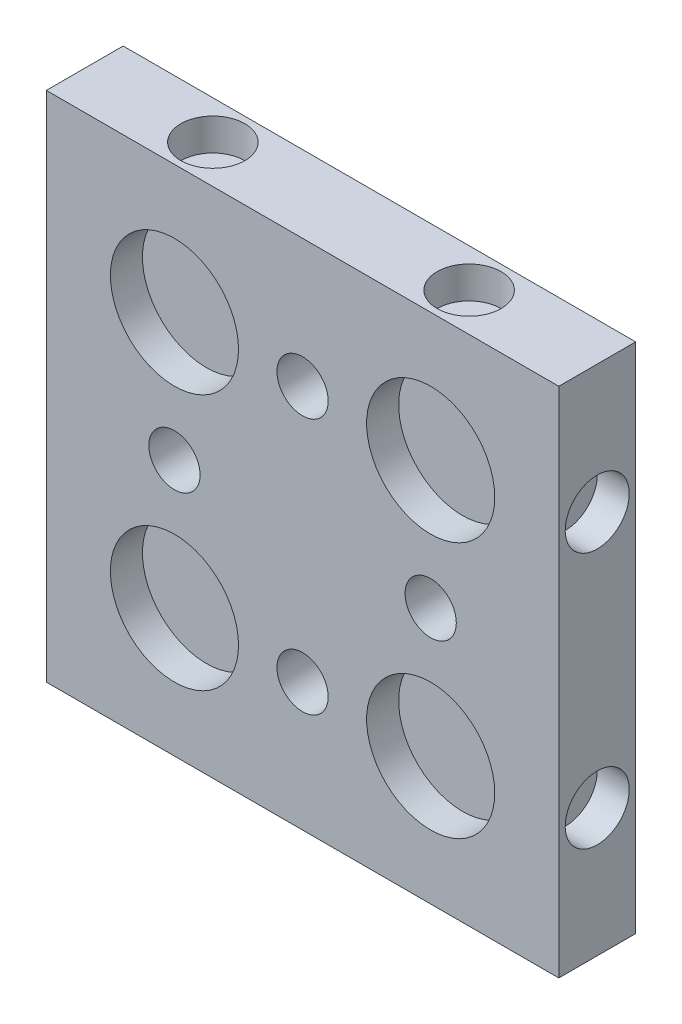
ISO-10303-21;
HEADER;
FILE_DESCRIPTION(('STEP AP214'),'2;1');
FILE_NAME('part.step','',(''),(''),'','','');
FILE_SCHEMA(('AUTOMOTIVE_DESIGN { 1 0 10303 214 1 1 1 1 }'));
ENDSEC;
DATA;
#1=APPLICATION_CONTEXT('core data for automotive mechanical design processes');
#2=APPLICATION_PROTOCOL_DEFINITION('international standard','automotive_design',2000,#1);
#3=PRODUCT_CONTEXT('',#1,'mechanical');
#4=PRODUCT('Part','Part','',(#3));
#5=PRODUCT_RELATED_PRODUCT_CATEGORY('part','',(#4));
#6=PRODUCT_DEFINITION_FORMATION('','',#4);
#7=PRODUCT_DEFINITION_CONTEXT('part definition',#1,'design');
#8=PRODUCT_DEFINITION('design','',#6,#7);
#9=PRODUCT_DEFINITION_SHAPE('','',#8);
#10=(LENGTH_UNIT() NAMED_UNIT(*) SI_UNIT(.MILLI.,.METRE.));
#11=(NAMED_UNIT(*) PLANE_ANGLE_UNIT() SI_UNIT($,.RADIAN.));
#12=(NAMED_UNIT(*) SI_UNIT($,.STERADIAN.) SOLID_ANGLE_UNIT());
#13=UNCERTAINTY_MEASURE_WITH_UNIT(LENGTH_MEASURE(1.E-05),#10,'distance_accuracy_value','');
#14=(GEOMETRIC_REPRESENTATION_CONTEXT(3) GLOBAL_UNCERTAINTY_ASSIGNED_CONTEXT((#13)) GLOBAL_UNIT_ASSIGNED_CONTEXT((#10,
#11,#12)) REPRESENTATION_CONTEXT('',''));
#15=CARTESIAN_POINT('',(0.,0.,0.));
#16=DIRECTION('',(0.,0.,1.));
#17=DIRECTION('',(1.,0.,0.));
#18=AXIS2_PLACEMENT_3D('',#15,#16,#17);
#19=CARTESIAN_POINT('',(-21.3507246376812,25.9521739130435,7.62));
#20=DIRECTION('',(1.,0.,0.));
#21=DIRECTION('',(0.,1.,0.));
#22=AXIS2_PLACEMENT_3D('',#19,#20,#21);
#23=PLANE('',#22);
#24=CARTESIAN_POINT('',(-21.3507246376812,13.2521739130435,3.81));
#25=DIRECTION('',(-1.,0.,0.));
#26=DIRECTION('',(0.,-1.,0.));
#27=AXIS2_PLACEMENT_3D('',#24,#25,#26);
#28=CIRCLE('',#27,3.175);
#29=CARTESIAN_POINT('',(-21.3507246376812,10.0771739130435,3.81));
#30=VERTEX_POINT('',#29);
#31=EDGE_CURVE('E239',#30,#30,#28,.T.);
#32=ORIENTED_EDGE('',*,*,#31,.F.);
#33=EDGE_LOOP('',(#32));
#34=FACE_BOUND('',#33,.T.);
#35=CARTESIAN_POINT('',(-21.3507246376812,-12.1478260869565,3.81));
#36=DIRECTION('',(-1.,0.,0.));
#37=DIRECTION('',(0.,-1.,0.));
#38=AXIS2_PLACEMENT_3D('',#35,#36,#37);
#39=CIRCLE('',#38,3.175);
#40=CARTESIAN_POINT('',(-21.3507246376812,-15.3228260869565,3.81));
#41=VERTEX_POINT('',#40);
#42=EDGE_CURVE('E234',#41,#41,#39,.T.);
#43=ORIENTED_EDGE('',*,*,#42,.F.);
#44=EDGE_LOOP('',(#43));
#45=FACE_BOUND('',#44,.T.);
#46=DIRECTION('',(0.,-1.,0.));
#47=VECTOR('',#46,1.);
#48=CARTESIAN_POINT('',(-21.3507246376812,25.9521739130435,0.));
#49=LINE('',#48,#47);
#50=CARTESIAN_POINT('',(-21.3507246376812,25.9521739130435,0.));
#51=VERTEX_POINT('',#50);
#52=CARTESIAN_POINT('',(-21.3507246376812,-24.8478260869565,0.));
#53=VERTEX_POINT('',#52);
#54=EDGE_CURVE('E113',#51,#53,#49,.T.);
#55=ORIENTED_EDGE('',*,*,#54,.T.);
#56=DIRECTION('',(0.,0.,-1.));
#57=VECTOR('',#56,1.);
#58=CARTESIAN_POINT('',(-21.3507246376812,-24.8478260869565,7.62));
#59=LINE('',#58,#57);
#60=CARTESIAN_POINT('',(-21.3507246376812,-24.8478260869565,7.62));
#61=VERTEX_POINT('',#60);
#62=EDGE_CURVE('E11',#61,#53,#59,.T.);
#63=ORIENTED_EDGE('',*,*,#62,.F.);
#64=DIRECTION('',(0.,-1.,0.));
#65=VECTOR('',#64,1.);
#66=CARTESIAN_POINT('',(-21.3507246376812,25.9521739130435,7.62));
#67=LINE('',#66,#65);
#68=CARTESIAN_POINT('',(-21.3507246376812,25.9521739130435,7.62));
#69=VERTEX_POINT('',#68);
#70=EDGE_CURVE('E97',#69,#61,#67,.T.);
#71=ORIENTED_EDGE('',*,*,#70,.F.);
#72=DIRECTION('',(0.,0.,-1.));
#73=VECTOR('',#72,1.);
#74=CARTESIAN_POINT('',(-21.3507246376812,25.9521739130435,7.62));
#75=LINE('',#74,#73);
#76=EDGE_CURVE('E109',#69,#51,#75,.T.);
#77=ORIENTED_EDGE('',*,*,#76,.T.);
#78=EDGE_LOOP('',(#55,#63,#71,#77));
#79=FACE_BOUND('',#78,.T.);
#80=ADVANCED_FACE('F45',(#34,#45,#79),#23,.F.);
#81=CARTESIAN_POINT('',(-21.3507246376812,-24.8478260869565,7.62));
#82=DIRECTION('',(0.,1.,0.));
#83=DIRECTION('',(0.,0.,1.));
#84=AXIS2_PLACEMENT_3D('',#81,#82,#83);
#85=PLANE('',#84);
#86=CARTESIAN_POINT('',(-8.65072463768117,-24.8478260869565,3.81));
#87=DIRECTION('',(0.,-1.,0.));
#88=DIRECTION('',(0.,0.,-1.));
#89=AXIS2_PLACEMENT_3D('',#86,#87,#88);
#90=CIRCLE('',#89,3.175);
#91=CARTESIAN_POINT('',(-8.65072463768117,-24.8478260869565,0.634999999999998));
#92=VERTEX_POINT('',#91);
#93=EDGE_CURVE('E223',#92,#92,#90,.T.);
#94=ORIENTED_EDGE('',*,*,#93,.F.);
#95=EDGE_LOOP('',(#94));
#96=FACE_BOUND('',#95,.T.);
#97=CARTESIAN_POINT('',(16.7492753623188,-24.8478260869565,3.81));
#98=DIRECTION('',(0.,-1.,0.));
#99=DIRECTION('',(0.,0.,-1.));
#100=AXIS2_PLACEMENT_3D('',#97,#98,#99);
#101=CIRCLE('',#100,3.175);
#102=CARTESIAN_POINT('',(16.7492753623188,-24.8478260869565,0.634999999999998));
#103=VERTEX_POINT('',#102);
#104=EDGE_CURVE('E218',#103,#103,#101,.T.);
#105=ORIENTED_EDGE('',*,*,#104,.F.);
#106=EDGE_LOOP('',(#105));
#107=FACE_BOUND('',#106,.T.);
#108=DIRECTION('',(1.,0.,0.));
#109=VECTOR('',#108,1.);
#110=CARTESIAN_POINT('',(-21.3507246376812,-24.8478260869565,0.));
#111=LINE('',#110,#109);
#112=CARTESIAN_POINT('',(29.4492753623188,-24.8478260869565,0.));
#113=VERTEX_POINT('',#112);
#114=EDGE_CURVE('E102',#53,#113,#111,.T.);
#115=ORIENTED_EDGE('',*,*,#114,.T.);
#116=DIRECTION('',(0.,0.,-1.));
#117=VECTOR('',#116,1.);
#118=CARTESIAN_POINT('',(29.4492753623188,-24.8478260869565,7.62));
#119=LINE('',#118,#117);
#120=CARTESIAN_POINT('',(29.4492753623188,-24.8478260869565,7.62));
#121=VERTEX_POINT('',#120);
#122=EDGE_CURVE('E54',#121,#113,#119,.T.);
#123=ORIENTED_EDGE('',*,*,#122,.F.);
#124=DIRECTION('',(1.,0.,0.));
#125=VECTOR('',#124,1.);
#126=CARTESIAN_POINT('',(-21.3507246376812,-24.8478260869565,7.62));
#127=LINE('',#126,#125);
#128=EDGE_CURVE('E92',#61,#121,#127,.T.);
#129=ORIENTED_EDGE('',*,*,#128,.F.);
#130=ORIENTED_EDGE('',*,*,#62,.T.);
#131=EDGE_LOOP('',(#115,#123,#129,#130));
#132=FACE_BOUND('',#131,.T.);
#133=ADVANCED_FACE('F101',(#96,#107,#132),#85,.F.);
#134=CARTESIAN_POINT('',(29.4492753623188,25.9521739130435,7.62));
#135=DIRECTION('',(-1.,0.,0.));
#136=DIRECTION('',(0.,-1.,0.));
#137=AXIS2_PLACEMENT_3D('',#134,#135,#136);
#138=PLANE('',#137);
#139=CARTESIAN_POINT('',(29.4492753623188,13.2521739130435,3.81));
#140=DIRECTION('',(1.,0.,0.));
#141=DIRECTION('',(0.,1.,0.));
#142=AXIS2_PLACEMENT_3D('',#139,#140,#141);
#143=CIRCLE('',#142,3.175);
#144=CARTESIAN_POINT('',(29.4492753623188,16.4271739130435,3.81));
#145=VERTEX_POINT('',#144);
#146=EDGE_CURVE('E207',#145,#145,#143,.T.);
#147=ORIENTED_EDGE('',*,*,#146,.F.);
#148=EDGE_LOOP('',(#147));
#149=FACE_BOUND('',#148,.T.);
#150=CARTESIAN_POINT('',(29.4492753623188,-12.1478260869565,3.81));
#151=DIRECTION('',(1.,0.,0.));
#152=DIRECTION('',(0.,1.,0.));
#153=AXIS2_PLACEMENT_3D('',#150,#151,#152);
#154=CIRCLE('',#153,3.175);
#155=CARTESIAN_POINT('',(29.4492753623188,-8.97282608695651,3.81));
#156=VERTEX_POINT('',#155);
#157=EDGE_CURVE('E202',#156,#156,#154,.T.);
#158=ORIENTED_EDGE('',*,*,#157,.F.);
#159=EDGE_LOOP('',(#158));
#160=FACE_BOUND('',#159,.T.);
#161=DIRECTION('',(0.,1.,0.));
#162=VECTOR('',#161,1.);
#163=CARTESIAN_POINT('',(29.4492753623188,25.9521739130435,0.));
#164=LINE('',#163,#162);
#165=CARTESIAN_POINT('',(29.4492753623188,25.9521739130435,0.));
#166=VERTEX_POINT('',#165);
#167=EDGE_CURVE('E79',#113,#166,#164,.T.);
#168=ORIENTED_EDGE('',*,*,#167,.T.);
#169=DIRECTION('',(0.,0.,-1.));
#170=VECTOR('',#169,1.);
#171=CARTESIAN_POINT('',(29.4492753623188,25.9521739130435,7.62));
#172=LINE('',#171,#170);
#173=CARTESIAN_POINT('',(29.4492753623188,25.9521739130435,7.62));
#174=VERTEX_POINT('',#173);
#175=EDGE_CURVE('E104',#174,#166,#172,.T.);
#176=ORIENTED_EDGE('',*,*,#175,.F.);
#177=DIRECTION('',(0.,1.,0.));
#178=VECTOR('',#177,1.);
#179=CARTESIAN_POINT('',(29.4492753623188,25.9521739130435,7.62));
#180=LINE('',#179,#178);
#181=EDGE_CURVE('E95',#121,#174,#180,.T.);
#182=ORIENTED_EDGE('',*,*,#181,.F.);
#183=ORIENTED_EDGE('',*,*,#122,.T.);
#184=EDGE_LOOP('',(#168,#176,#182,#183));
#185=FACE_BOUND('',#184,.T.);
#186=ADVANCED_FACE('F105',(#149,#160,#185),#138,.F.);
#187=CARTESIAN_POINT('',(-21.3507246376812,25.9521739130435,7.62));
#188=DIRECTION('',(0.,-1.,0.));
#189=DIRECTION('',(0.,0.,-1.));
#190=AXIS2_PLACEMENT_3D('',#187,#188,#189);
#191=PLANE('',#190);
#192=CARTESIAN_POINT('',(-8.65072463768118,25.9521739130435,3.81));
#193=DIRECTION('',(0.,1.,0.));
#194=DIRECTION('',(0.,0.,1.));
#195=AXIS2_PLACEMENT_3D('',#192,#193,#194);
#196=CIRCLE('',#195,3.175);
#197=CARTESIAN_POINT('',(-8.65072463768118,25.9521739130435,6.985));
#198=VERTEX_POINT('',#197);
#199=EDGE_CURVE('E254',#198,#198,#196,.T.);
#200=ORIENTED_EDGE('',*,*,#199,.F.);
#201=EDGE_LOOP('',(#200));
#202=FACE_BOUND('',#201,.T.);
#203=CARTESIAN_POINT('',(16.7492753623188,25.9521739130435,3.81));
#204=DIRECTION('',(0.,1.,0.));
#205=DIRECTION('',(0.,0.,1.));
#206=AXIS2_PLACEMENT_3D('',#203,#204,#205);
#207=CIRCLE('',#206,3.175);
#208=CARTESIAN_POINT('',(16.7492753623188,25.9521739130435,6.985));
#209=VERTEX_POINT('',#208);
#210=EDGE_CURVE('E250',#209,#209,#207,.T.);
#211=ORIENTED_EDGE('',*,*,#210,.F.);
#212=EDGE_LOOP('',(#211));
#213=FACE_BOUND('',#212,.T.);
#214=DIRECTION('',(-1.,0.,0.));
#215=VECTOR('',#214,1.);
#216=CARTESIAN_POINT('',(-21.3507246376812,25.9521739130435,0.));
#217=LINE('',#216,#215);
#218=EDGE_CURVE('E85',#166,#51,#217,.T.);
#219=ORIENTED_EDGE('',*,*,#218,.T.);
#220=ORIENTED_EDGE('',*,*,#76,.F.);
#221=DIRECTION('',(-1.,0.,0.));
#222=VECTOR('',#221,1.);
#223=CARTESIAN_POINT('',(-21.3507246376812,25.9521739130435,7.62));
#224=LINE('',#223,#222);
#225=EDGE_CURVE('E62',#174,#69,#224,.T.);
#226=ORIENTED_EDGE('',*,*,#225,.F.);
#227=ORIENTED_EDGE('',*,*,#175,.T.);
#228=EDGE_LOOP('',(#219,#220,#226,#227));
#229=FACE_BOUND('',#228,.T.);
#230=ADVANCED_FACE('F127',(#202,#213,#229),#191,.F.);
#231=CARTESIAN_POINT('',(0.,0.,7.62));
#232=DIRECTION('',(0.,0.,1.));
#233=DIRECTION('',(1.,0.,0.));
#234=AXIS2_PLACEMENT_3D('',#231,#232,#233);
#235=PLANE('',#234);
#236=CARTESIAN_POINT('',(-8.65072463768118,-12.1478260869565,7.62));
#237=DIRECTION('',(0.,0.,1.));
#238=DIRECTION('',(1.,0.,0.));
#239=AXIS2_PLACEMENT_3D('',#236,#237,#238);
#240=CIRCLE('',#239,6.35);
#241=CARTESIAN_POINT('',(-2.30072463768118,-12.1478260869565,7.62));
#242=VERTEX_POINT('',#241);
#243=EDGE_CURVE('E178',#242,#242,#240,.T.);
#244=ORIENTED_EDGE('',*,*,#243,.F.);
#245=EDGE_LOOP('',(#244));
#246=FACE_BOUND('',#245,.T.);
#247=CARTESIAN_POINT('',(16.7492753623188,-12.1478260869565,7.62));
#248=DIRECTION('',(0.,0.,1.));
#249=DIRECTION('',(1.,0.,0.));
#250=AXIS2_PLACEMENT_3D('',#247,#248,#249);
#251=CIRCLE('',#250,6.35);
#252=CARTESIAN_POINT('',(23.0992753623188,-12.1478260869565,7.62));
#253=VERTEX_POINT('',#252);
#254=EDGE_CURVE('E187',#253,#253,#251,.T.);
#255=ORIENTED_EDGE('',*,*,#254,.F.);
#256=EDGE_LOOP('',(#255));
#257=FACE_BOUND('',#256,.T.);
#258=CARTESIAN_POINT('',(16.7492753623188,13.2521739130435,7.62));
#259=DIRECTION('',(0.,0.,1.));
#260=DIRECTION('',(1.,0.,0.));
#261=AXIS2_PLACEMENT_3D('',#258,#259,#260);
#262=CIRCLE('',#261,6.35);
#263=CARTESIAN_POINT('',(23.0992753623188,13.2521739130435,7.62));
#264=VERTEX_POINT('',#263);
#265=EDGE_CURVE('E170',#264,#264,#262,.T.);
#266=ORIENTED_EDGE('',*,*,#265,.F.);
#267=EDGE_LOOP('',(#266));
#268=FACE_BOUND('',#267,.T.);
#269=CARTESIAN_POINT('',(-8.65072463768118,13.2521739130435,7.62));
#270=DIRECTION('',(0.,0.,1.));
#271=DIRECTION('',(1.,0.,0.));
#272=AXIS2_PLACEMENT_3D('',#269,#270,#271);
#273=CIRCLE('',#272,6.35);
#274=CARTESIAN_POINT('',(-2.30072463768118,13.2521739130435,7.62));
#275=VERTEX_POINT('',#274);
#276=EDGE_CURVE('E166',#275,#275,#273,.T.);
#277=ORIENTED_EDGE('',*,*,#276,.F.);
#278=EDGE_LOOP('',(#277));
#279=FACE_BOUND('',#278,.T.);
#280=CARTESIAN_POINT('',(-8.65072463768117,0.552173913043488,7.62));
#281=DIRECTION('',(0.,0.,1.));
#282=DIRECTION('',(1.,0.,0.));
#283=AXIS2_PLACEMENT_3D('',#280,#281,#282);
#284=CIRCLE('',#283,2.54);
#285=CARTESIAN_POINT('',(-6.11072463768117,0.552173913043488,7.62));
#286=VERTEX_POINT('',#285);
#287=EDGE_CURVE('E159',#286,#286,#284,.T.);
#288=ORIENTED_EDGE('',*,*,#287,.F.);
#289=EDGE_LOOP('',(#288));
#290=FACE_BOUND('',#289,.T.);
#291=CARTESIAN_POINT('',(4.04927536231882,13.2521739130435,7.62));
#292=DIRECTION('',(0.,0.,1.));
#293=DIRECTION('',(1.,0.,0.));
#294=AXIS2_PLACEMENT_3D('',#291,#292,#293);
#295=CIRCLE('',#294,2.54);
#296=CARTESIAN_POINT('',(6.58927536231882,13.2521739130435,7.62));
#297=VERTEX_POINT('',#296);
#298=EDGE_CURVE('E155',#297,#297,#295,.T.);
#299=ORIENTED_EDGE('',*,*,#298,.F.);
#300=EDGE_LOOP('',(#299));
#301=FACE_BOUND('',#300,.T.);
#302=CARTESIAN_POINT('',(4.04927536231883,-12.1478260869565,7.62));
#303=DIRECTION('',(0.,0.,1.));
#304=DIRECTION('',(1.,0.,0.));
#305=AXIS2_PLACEMENT_3D('',#302,#303,#304);
#306=CIRCLE('',#305,2.54);
#307=CARTESIAN_POINT('',(6.58927536231883,-12.1478260869565,7.62));
#308=VERTEX_POINT('',#307);
#309=EDGE_CURVE('E147',#308,#308,#306,.T.);
#310=ORIENTED_EDGE('',*,*,#309,.F.);
#311=EDGE_LOOP('',(#310));
#312=FACE_BOUND('',#311,.T.);
#313=CARTESIAN_POINT('',(16.7492753623188,0.552173913043491,7.62));
#314=DIRECTION('',(0.,0.,1.));
#315=DIRECTION('',(1.,0.,0.));
#316=AXIS2_PLACEMENT_3D('',#313,#314,#315);
#317=CIRCLE('',#316,2.54);
#318=CARTESIAN_POINT('',(19.2892753623188,0.552173913043491,7.62));
#319=VERTEX_POINT('',#318);
#320=EDGE_CURVE('E138',#319,#319,#317,.T.);
#321=ORIENTED_EDGE('',*,*,#320,.F.);
#322=EDGE_LOOP('',(#321));
#323=FACE_BOUND('',#322,.T.);
#324=ORIENTED_EDGE('',*,*,#70,.T.);
#325=ORIENTED_EDGE('',*,*,#128,.T.);
#326=ORIENTED_EDGE('',*,*,#181,.T.);
#327=ORIENTED_EDGE('',*,*,#225,.T.);
#328=EDGE_LOOP('',(#324,#325,#326,#327));
#329=FACE_BOUND('',#328,.T.);
#330=ADVANCED_FACE('F93',(#246,#257,#268,#279,#290,#301,#312,#323,#329),#235,.T.);
#331=CARTESIAN_POINT('',(0.,0.,0.));
#332=DIRECTION('',(0.,0.,1.));
#333=DIRECTION('',(1.,0.,0.));
#334=AXIS2_PLACEMENT_3D('',#331,#332,#333);
#335=PLANE('',#334);
#336=ORIENTED_EDGE('',*,*,#54,.F.);
#337=ORIENTED_EDGE('',*,*,#218,.F.);
#338=ORIENTED_EDGE('',*,*,#167,.F.);
#339=ORIENTED_EDGE('',*,*,#114,.F.);
#340=EDGE_LOOP('',(#336,#337,#338,#339));
#341=FACE_BOUND('',#340,.T.);
#342=ADVANCED_FACE('F130',(#341),#335,.F.);
#343=CARTESIAN_POINT('',(16.7492753623188,0.552173913043491,1.27));
#344=DIRECTION('',(0.,0.,1.));
#345=DIRECTION('',(1.,0.,0.));
#346=AXIS2_PLACEMENT_3D('',#343,#344,#345);
#347=CYLINDRICAL_SURFACE('',#346,2.54);
#348=CARTESIAN_POINT('',(16.7492753623188,0.552173913043491,1.27));
#349=DIRECTION('',(0.,0.,1.));
#350=DIRECTION('',(1.,0.,0.));
#351=AXIS2_PLACEMENT_3D('',#348,#349,#350);
#352=CIRCLE('',#351,2.54);
#353=CARTESIAN_POINT('',(19.2892753623188,0.552173913043491,1.27));
#354=VERTEX_POINT('',#353);
#355=EDGE_CURVE('E134',#354,#354,#352,.T.);
#356=ORIENTED_EDGE('',*,*,#355,.F.);
#357=EDGE_LOOP('',(#356));
#358=FACE_BOUND('',#357,.T.);
#359=ORIENTED_EDGE('',*,*,#320,.T.);
#360=EDGE_LOOP('',(#359));
#361=FACE_BOUND('',#360,.T.);
#362=ADVANCED_FACE('F403',(#358,#361),#347,.F.);
#363=CARTESIAN_POINT('',(16.7492753623188,0.552173913043491,1.27));
#364=DIRECTION('',(0.,0.,1.));
#365=DIRECTION('',(1.,0.,0.));
#366=AXIS2_PLACEMENT_3D('',#363,#364,#365);
#367=PLANE('',#366);
#368=ORIENTED_EDGE('',*,*,#355,.T.);
#369=EDGE_LOOP('',(#368));
#370=FACE_BOUND('',#369,.T.);
#371=ADVANCED_FACE('F398',(#370),#367,.T.);
#372=CARTESIAN_POINT('',(4.04927536231883,-12.1478260869565,1.27));
#373=DIRECTION('',(0.,0.,1.));
#374=DIRECTION('',(1.,0.,0.));
#375=AXIS2_PLACEMENT_3D('',#372,#373,#374);
#376=CYLINDRICAL_SURFACE('',#375,2.54);
#377=CARTESIAN_POINT('',(4.04927536231883,-12.1478260869565,1.27));
#378=DIRECTION('',(0.,0.,1.));
#379=DIRECTION('',(1.,0.,0.));
#380=AXIS2_PLACEMENT_3D('',#377,#378,#379);
#381=CIRCLE('',#380,2.54);
#382=CARTESIAN_POINT('',(6.58927536231883,-12.1478260869565,1.27));
#383=VERTEX_POINT('',#382);
#384=EDGE_CURVE('E143',#383,#383,#381,.T.);
#385=ORIENTED_EDGE('',*,*,#384,.F.);
#386=EDGE_LOOP('',(#385));
#387=FACE_BOUND('',#386,.T.);
#388=ORIENTED_EDGE('',*,*,#309,.T.);
#389=EDGE_LOOP('',(#388));
#390=FACE_BOUND('',#389,.T.);
#391=ADVANCED_FACE('F395',(#387,#390),#376,.F.);
#392=CARTESIAN_POINT('',(4.04927536231883,-12.1478260869565,1.27));
#393=DIRECTION('',(0.,0.,1.));
#394=DIRECTION('',(1.,0.,0.));
#395=AXIS2_PLACEMENT_3D('',#392,#393,#394);
#396=PLANE('',#395);
#397=ORIENTED_EDGE('',*,*,#384,.T.);
#398=EDGE_LOOP('',(#397));
#399=FACE_BOUND('',#398,.T.);
#400=ADVANCED_FACE('F390',(#399),#396,.T.);
#401=CARTESIAN_POINT('',(4.04927536231882,13.2521739130435,1.27));
#402=DIRECTION('',(0.,0.,1.));
#403=DIRECTION('',(1.,0.,0.));
#404=AXIS2_PLACEMENT_3D('',#401,#402,#403);
#405=CYLINDRICAL_SURFACE('',#404,2.54);
#406=CARTESIAN_POINT('',(4.04927536231882,13.2521739130435,1.27));
#407=DIRECTION('',(0.,0.,1.));
#408=DIRECTION('',(1.,0.,0.));
#409=AXIS2_PLACEMENT_3D('',#406,#407,#408);
#410=CIRCLE('',#409,2.54);
#411=CARTESIAN_POINT('',(6.58927536231882,13.2521739130435,1.27));
#412=VERTEX_POINT('',#411);
#413=EDGE_CURVE('E151',#412,#412,#410,.T.);
#414=ORIENTED_EDGE('',*,*,#413,.F.);
#415=EDGE_LOOP('',(#414));
#416=FACE_BOUND('',#415,.T.);
#417=ORIENTED_EDGE('',*,*,#298,.T.);
#418=EDGE_LOOP('',(#417));
#419=FACE_BOUND('',#418,.T.);
#420=ADVANCED_FACE('F387',(#416,#419),#405,.F.);
#421=CARTESIAN_POINT('',(4.04927536231882,13.2521739130435,1.27));
#422=DIRECTION('',(0.,0.,1.));
#423=DIRECTION('',(1.,0.,0.));
#424=AXIS2_PLACEMENT_3D('',#421,#422,#423);
#425=PLANE('',#424);
#426=ORIENTED_EDGE('',*,*,#413,.T.);
#427=EDGE_LOOP('',(#426));
#428=FACE_BOUND('',#427,.T.);
#429=ADVANCED_FACE('F385',(#428),#425,.T.);
#430=CARTESIAN_POINT('',(-8.65072463768117,0.552173913043488,1.27));
#431=DIRECTION('',(0.,0.,1.));
#432=DIRECTION('',(1.,0.,0.));
#433=AXIS2_PLACEMENT_3D('',#430,#431,#432);
#434=CYLINDRICAL_SURFACE('',#433,2.54);
#435=CARTESIAN_POINT('',(-8.65072463768117,0.552173913043488,1.27));
#436=DIRECTION('',(0.,0.,1.));
#437=DIRECTION('',(1.,0.,0.));
#438=AXIS2_PLACEMENT_3D('',#435,#436,#437);
#439=CIRCLE('',#438,2.54);
#440=CARTESIAN_POINT('',(-6.11072463768117,0.552173913043488,1.27));
#441=VERTEX_POINT('',#440);
#442=EDGE_CURVE('E117',#441,#441,#439,.T.);
#443=ORIENTED_EDGE('',*,*,#442,.F.);
#444=EDGE_LOOP('',(#443));
#445=FACE_BOUND('',#444,.T.);
#446=ORIENTED_EDGE('',*,*,#287,.T.);
#447=EDGE_LOOP('',(#446));
#448=FACE_BOUND('',#447,.T.);
#449=ADVANCED_FACE('F381',(#445,#448),#434,.F.);
#450=CARTESIAN_POINT('',(-8.65072463768117,0.552173913043488,1.27));
#451=DIRECTION('',(0.,0.,1.));
#452=DIRECTION('',(1.,0.,0.));
#453=AXIS2_PLACEMENT_3D('',#450,#451,#452);
#454=PLANE('',#453);
#455=ORIENTED_EDGE('',*,*,#442,.T.);
#456=EDGE_LOOP('',(#455));
#457=FACE_BOUND('',#456,.T.);
#458=ADVANCED_FACE('F377',(#457),#454,.T.);
#459=CARTESIAN_POINT('',(-8.65072463768118,13.2521739130435,4.445));
#460=DIRECTION('',(0.,0.,1.));
#461=DIRECTION('',(1.,0.,0.));
#462=AXIS2_PLACEMENT_3D('',#459,#460,#461);
#463=CYLINDRICAL_SURFACE('',#462,6.35);
#464=CARTESIAN_POINT('',(-8.65072463768118,13.2521739130435,4.445));
#465=DIRECTION('',(0.,0.,1.));
#466=DIRECTION('',(1.,0.,0.));
#467=AXIS2_PLACEMENT_3D('',#464,#465,#466);
#468=CIRCLE('',#467,6.35);
#469=CARTESIAN_POINT('',(-2.30072463768118,13.2521739130435,4.445));
#470=VERTEX_POINT('',#469);
#471=EDGE_CURVE('E139',#470,#470,#468,.T.);
#472=ORIENTED_EDGE('',*,*,#471,.F.);
#473=EDGE_LOOP('',(#472));
#474=FACE_BOUND('',#473,.T.);
#475=ORIENTED_EDGE('',*,*,#276,.T.);
#476=EDGE_LOOP('',(#475));
#477=FACE_BOUND('',#476,.T.);
#478=ADVANCED_FACE('F373',(#474,#477),#463,.F.);
#479=CARTESIAN_POINT('',(-8.65072463768118,13.2521739130435,4.445));
#480=DIRECTION('',(0.,0.,1.));
#481=DIRECTION('',(1.,0.,0.));
#482=AXIS2_PLACEMENT_3D('',#479,#480,#481);
#483=PLANE('',#482);
#484=ORIENTED_EDGE('',*,*,#471,.T.);
#485=EDGE_LOOP('',(#484));
#486=FACE_BOUND('',#485,.T.);
#487=ADVANCED_FACE('F351',(#486),#483,.T.);
#488=CARTESIAN_POINT('',(16.7492753623188,13.2521739130435,4.445));
#489=DIRECTION('',(0.,0.,1.));
#490=DIRECTION('',(1.,0.,0.));
#491=AXIS2_PLACEMENT_3D('',#488,#489,#490);
#492=CYLINDRICAL_SURFACE('',#491,6.35);
#493=CARTESIAN_POINT('',(16.7492753623188,13.2521739130435,4.445));
#494=DIRECTION('',(0.,0.,1.));
#495=DIRECTION('',(1.,0.,0.));
#496=AXIS2_PLACEMENT_3D('',#493,#494,#495);
#497=CIRCLE('',#496,6.35);
#498=CARTESIAN_POINT('',(23.0992753623188,13.2521739130435,4.445));
#499=VERTEX_POINT('',#498);
#500=EDGE_CURVE('E191',#499,#499,#497,.T.);
#501=ORIENTED_EDGE('',*,*,#500,.F.);
#502=EDGE_LOOP('',(#501));
#503=FACE_BOUND('',#502,.T.);
#504=ORIENTED_EDGE('',*,*,#265,.T.);
#505=EDGE_LOOP('',(#504));
#506=FACE_BOUND('',#505,.T.);
#507=ADVANCED_FACE('F347',(#503,#506),#492,.F.);
#508=CARTESIAN_POINT('',(16.7492753623188,13.2521739130435,4.445));
#509=DIRECTION('',(0.,0.,1.));
#510=DIRECTION('',(1.,0.,0.));
#511=AXIS2_PLACEMENT_3D('',#508,#509,#510);
#512=PLANE('',#511);
#513=ORIENTED_EDGE('',*,*,#500,.T.);
#514=EDGE_LOOP('',(#513));
#515=FACE_BOUND('',#514,.T.);
#516=ADVANCED_FACE('F350',(#515),#512,.T.);
#517=CARTESIAN_POINT('',(16.7492753623188,-12.1478260869565,4.445));
#518=DIRECTION('',(0.,0.,1.));
#519=DIRECTION('',(1.,0.,0.));
#520=AXIS2_PLACEMENT_3D('',#517,#518,#519);
#521=CYLINDRICAL_SURFACE('',#520,6.35);
#522=CARTESIAN_POINT('',(16.7492753623188,-12.1478260869565,4.445));
#523=DIRECTION('',(0.,0.,1.));
#524=DIRECTION('',(1.,0.,0.));
#525=AXIS2_PLACEMENT_3D('',#522,#523,#524);
#526=CIRCLE('',#525,6.35);
#527=CARTESIAN_POINT('',(23.0992753623188,-12.1478260869565,4.445));
#528=VERTEX_POINT('',#527);
#529=EDGE_CURVE('E183',#528,#528,#526,.T.);
#530=ORIENTED_EDGE('',*,*,#529,.F.);
#531=EDGE_LOOP('',(#530));
#532=FACE_BOUND('',#531,.T.);
#533=ORIENTED_EDGE('',*,*,#254,.T.);
#534=EDGE_LOOP('',(#533));
#535=FACE_BOUND('',#534,.T.);
#536=ADVANCED_FACE('F355',(#532,#535),#521,.F.);
#537=CARTESIAN_POINT('',(16.7492753623188,-12.1478260869565,4.445));
#538=DIRECTION('',(0.,0.,1.));
#539=DIRECTION('',(1.,0.,0.));
#540=AXIS2_PLACEMENT_3D('',#537,#538,#539);
#541=PLANE('',#540);
#542=ORIENTED_EDGE('',*,*,#529,.T.);
#543=EDGE_LOOP('',(#542));
#544=FACE_BOUND('',#543,.T.);
#545=ADVANCED_FACE('F359',(#544),#541,.T.);
#546=CARTESIAN_POINT('',(-8.65072463768118,-12.1478260869565,4.445));
#547=DIRECTION('',(0.,0.,1.));
#548=DIRECTION('',(1.,0.,0.));
#549=AXIS2_PLACEMENT_3D('',#546,#547,#548);
#550=CYLINDRICAL_SURFACE('',#549,6.35);
#551=CARTESIAN_POINT('',(-8.65072463768118,-12.1478260869565,4.445));
#552=DIRECTION('',(0.,0.,1.));
#553=DIRECTION('',(1.,0.,0.));
#554=AXIS2_PLACEMENT_3D('',#551,#552,#553);
#555=CIRCLE('',#554,6.35);
#556=CARTESIAN_POINT('',(-2.30072463768118,-12.1478260869565,4.445));
#557=VERTEX_POINT('',#556);
#558=EDGE_CURVE('E174',#557,#557,#555,.T.);
#559=ORIENTED_EDGE('',*,*,#558,.F.);
#560=EDGE_LOOP('',(#559));
#561=FACE_BOUND('',#560,.T.);
#562=ORIENTED_EDGE('',*,*,#243,.T.);
#563=EDGE_LOOP('',(#562));
#564=FACE_BOUND('',#563,.T.);
#565=ADVANCED_FACE('F363',(#561,#564),#550,.F.);
#566=CARTESIAN_POINT('',(-8.65072463768118,-12.1478260869565,4.445));
#567=DIRECTION('',(0.,0.,1.));
#568=DIRECTION('',(1.,0.,0.));
#569=AXIS2_PLACEMENT_3D('',#566,#567,#568);
#570=PLANE('',#569);
#571=ORIENTED_EDGE('',*,*,#558,.T.);
#572=EDGE_LOOP('',(#571));
#573=FACE_BOUND('',#572,.T.);
#574=ADVANCED_FACE('F342',(#573),#570,.T.);
#575=CARTESIAN_POINT('',(26.2742753623188,-12.1478260869565,3.81));
#576=DIRECTION('',(1.,0.,0.));
#577=DIRECTION('',(0.,1.,0.));
#578=AXIS2_PLACEMENT_3D('',#575,#576,#577);
#579=CYLINDRICAL_SURFACE('',#578,3.175);
#580=CARTESIAN_POINT('',(26.2742753623188,-12.1478260869565,3.81));
#581=DIRECTION('',(1.,0.,0.));
#582=DIRECTION('',(0.,1.,0.));
#583=AXIS2_PLACEMENT_3D('',#580,#581,#582);
#584=CIRCLE('',#583,3.175);
#585=CARTESIAN_POINT('',(26.2742753623188,-8.97282608695651,3.81));
#586=VERTEX_POINT('',#585);
#587=EDGE_CURVE('E198',#586,#586,#584,.T.);
#588=ORIENTED_EDGE('',*,*,#587,.F.);
#589=EDGE_LOOP('',(#588));
#590=FACE_BOUND('',#589,.T.);
#591=ORIENTED_EDGE('',*,*,#157,.T.);
#592=EDGE_LOOP('',(#591));
#593=FACE_BOUND('',#592,.T.);
#594=ADVANCED_FACE('F339',(#590,#593),#579,.F.);
#595=CARTESIAN_POINT('',(26.2742753623188,-12.1478260869565,3.81));
#596=DIRECTION('',(1.,0.,0.));
#597=DIRECTION('',(0.,1.,0.));
#598=AXIS2_PLACEMENT_3D('',#595,#596,#597);
#599=PLANE('',#598);
#600=ORIENTED_EDGE('',*,*,#587,.T.);
#601=EDGE_LOOP('',(#600));
#602=FACE_BOUND('',#601,.T.);
#603=ADVANCED_FACE('F337',(#602),#599,.T.);
#604=CARTESIAN_POINT('',(26.2742753623188,13.2521739130435,3.81));
#605=DIRECTION('',(1.,0.,0.));
#606=DIRECTION('',(0.,1.,0.));
#607=AXIS2_PLACEMENT_3D('',#604,#605,#606);
#608=CYLINDRICAL_SURFACE('',#607,3.175);
#609=CARTESIAN_POINT('',(26.2742753623188,13.2521739130435,3.81));
#610=DIRECTION('',(1.,0.,0.));
#611=DIRECTION('',(0.,1.,0.));
#612=AXIS2_PLACEMENT_3D('',#609,#610,#611);
#613=CIRCLE('',#612,3.175);
#614=CARTESIAN_POINT('',(26.2742753623188,16.4271739130435,3.81));
#615=VERTEX_POINT('',#614);
#616=EDGE_CURVE('E179',#615,#615,#613,.T.);
#617=ORIENTED_EDGE('',*,*,#616,.F.);
#618=EDGE_LOOP('',(#617));
#619=FACE_BOUND('',#618,.T.);
#620=ORIENTED_EDGE('',*,*,#146,.T.);
#621=EDGE_LOOP('',(#620));
#622=FACE_BOUND('',#621,.T.);
#623=ADVANCED_FACE('F333',(#619,#622),#608,.F.);
#624=CARTESIAN_POINT('',(26.2742753623188,13.2521739130435,3.81));
#625=DIRECTION('',(1.,0.,0.));
#626=DIRECTION('',(0.,1.,0.));
#627=AXIS2_PLACEMENT_3D('',#624,#625,#626);
#628=PLANE('',#627);
#629=ORIENTED_EDGE('',*,*,#616,.T.);
#630=EDGE_LOOP('',(#629));
#631=FACE_BOUND('',#630,.T.);
#632=ADVANCED_FACE('F326',(#631),#628,.T.);
#633=CARTESIAN_POINT('',(16.7492753623188,-21.6728260869565,3.81));
#634=DIRECTION('',(0.,-1.,0.));
#635=DIRECTION('',(0.,0.,-1.));
#636=AXIS2_PLACEMENT_3D('',#633,#634,#635);
#637=CYLINDRICAL_SURFACE('',#636,3.175);
#638=CARTESIAN_POINT('',(16.7492753623188,-21.6728260869565,3.81));
#639=DIRECTION('',(0.,-1.,0.));
#640=DIRECTION('',(0.,0.,-1.));
#641=AXIS2_PLACEMENT_3D('',#638,#639,#640);
#642=CIRCLE('',#641,3.175);
#643=CARTESIAN_POINT('',(16.7492753623188,-21.6728260869565,0.634999999999998));
#644=VERTEX_POINT('',#643);
#645=EDGE_CURVE('E214',#644,#644,#642,.T.);
#646=ORIENTED_EDGE('',*,*,#645,.F.);
#647=EDGE_LOOP('',(#646));
#648=FACE_BOUND('',#647,.T.);
#649=ORIENTED_EDGE('',*,*,#104,.T.);
#650=EDGE_LOOP('',(#649));
#651=FACE_BOUND('',#650,.T.);
#652=ADVANCED_FACE('F323',(#648,#651),#637,.F.);
#653=CARTESIAN_POINT('',(16.7492753623188,-21.6728260869565,3.81));
#654=DIRECTION('',(0.,-1.,0.));
#655=DIRECTION('',(0.,0.,-1.));
#656=AXIS2_PLACEMENT_3D('',#653,#654,#655);
#657=PLANE('',#656);
#658=ORIENTED_EDGE('',*,*,#645,.T.);
#659=EDGE_LOOP('',(#658));
#660=FACE_BOUND('',#659,.T.);
#661=ADVANCED_FACE('F321',(#660),#657,.T.);
#662=CARTESIAN_POINT('',(-8.65072463768117,-21.6728260869565,3.81));
#663=DIRECTION('',(0.,-1.,0.));
#664=DIRECTION('',(0.,0.,-1.));
#665=AXIS2_PLACEMENT_3D('',#662,#663,#664);
#666=CYLINDRICAL_SURFACE('',#665,3.175);
#667=CARTESIAN_POINT('',(-8.65072463768117,-21.6728260869565,3.81));
#668=DIRECTION('',(0.,-1.,0.));
#669=DIRECTION('',(0.,0.,-1.));
#670=AXIS2_PLACEMENT_3D('',#667,#668,#669);
#671=CIRCLE('',#670,3.175);
#672=CARTESIAN_POINT('',(-8.65072463768117,-21.6728260869565,0.634999999999998));
#673=VERTEX_POINT('',#672);
#674=EDGE_CURVE('E203',#673,#673,#671,.T.);
#675=ORIENTED_EDGE('',*,*,#674,.F.);
#676=EDGE_LOOP('',(#675));
#677=FACE_BOUND('',#676,.T.);
#678=ORIENTED_EDGE('',*,*,#93,.T.);
#679=EDGE_LOOP('',(#678));
#680=FACE_BOUND('',#679,.T.);
#681=ADVANCED_FACE('F313',(#677,#680),#666,.F.);
#682=CARTESIAN_POINT('',(-8.65072463768117,-21.6728260869565,3.81));
#683=DIRECTION('',(0.,-1.,0.));
#684=DIRECTION('',(0.,0.,-1.));
#685=AXIS2_PLACEMENT_3D('',#682,#683,#684);
#686=PLANE('',#685);
#687=ORIENTED_EDGE('',*,*,#674,.T.);
#688=EDGE_LOOP('',(#687));
#689=FACE_BOUND('',#688,.T.);
#690=ADVANCED_FACE('F305',(#689),#686,.T.);
#691=CARTESIAN_POINT('',(-18.1757246376812,-12.1478260869565,3.81));
#692=DIRECTION('',(-1.,0.,0.));
#693=DIRECTION('',(0.,-1.,0.));
#694=AXIS2_PLACEMENT_3D('',#691,#692,#693);
#695=CYLINDRICAL_SURFACE('',#694,3.175);
#696=CARTESIAN_POINT('',(-18.1757246376812,-12.1478260869565,3.81));
#697=DIRECTION('',(-1.,0.,0.));
#698=DIRECTION('',(0.,-1.,0.));
#699=AXIS2_PLACEMENT_3D('',#696,#697,#698);
#700=CIRCLE('',#699,3.175);
#701=CARTESIAN_POINT('',(-18.1757246376812,-15.3228260869565,3.81));
#702=VERTEX_POINT('',#701);
#703=EDGE_CURVE('E230',#702,#702,#700,.T.);
#704=ORIENTED_EDGE('',*,*,#703,.F.);
#705=EDGE_LOOP('',(#704));
#706=FACE_BOUND('',#705,.T.);
#707=ORIENTED_EDGE('',*,*,#42,.T.);
#708=EDGE_LOOP('',(#707));
#709=FACE_BOUND('',#708,.T.);
#710=ADVANCED_FACE('F303',(#706,#709),#695,.F.);
#711=CARTESIAN_POINT('',(-18.1757246376812,-12.1478260869565,3.81));
#712=DIRECTION('',(-1.,0.,0.));
#713=DIRECTION('',(0.,-1.,0.));
#714=AXIS2_PLACEMENT_3D('',#711,#712,#713);
#715=PLANE('',#714);
#716=ORIENTED_EDGE('',*,*,#703,.T.);
#717=EDGE_LOOP('',(#716));
#718=FACE_BOUND('',#717,.T.);
#719=ADVANCED_FACE('F304',(#718),#715,.T.);
#720=CARTESIAN_POINT('',(-18.1757246376812,13.2521739130435,3.81));
#721=DIRECTION('',(-1.,0.,0.));
#722=DIRECTION('',(0.,-1.,0.));
#723=AXIS2_PLACEMENT_3D('',#720,#721,#722);
#724=CYLINDRICAL_SURFACE('',#723,3.175);
#725=CARTESIAN_POINT('',(-18.1757246376812,13.2521739130435,3.81));
#726=DIRECTION('',(-1.,0.,0.));
#727=DIRECTION('',(0.,-1.,0.));
#728=AXIS2_PLACEMENT_3D('',#725,#726,#727);
#729=CIRCLE('',#728,3.175);
#730=CARTESIAN_POINT('',(-18.1757246376812,10.0771739130435,3.81));
#731=VERTEX_POINT('',#730);
#732=EDGE_CURVE('E219',#731,#731,#729,.T.);
#733=ORIENTED_EDGE('',*,*,#732,.F.);
#734=EDGE_LOOP('',(#733));
#735=FACE_BOUND('',#734,.T.);
#736=ORIENTED_EDGE('',*,*,#31,.T.);
#737=EDGE_LOOP('',(#736));
#738=FACE_BOUND('',#737,.T.);
#739=ADVANCED_FACE('F287',(#735,#738),#724,.F.);
#740=CARTESIAN_POINT('',(-18.1757246376812,13.2521739130435,3.81));
#741=DIRECTION('',(-1.,0.,0.));
#742=DIRECTION('',(0.,-1.,0.));
#743=AXIS2_PLACEMENT_3D('',#740,#741,#742);
#744=PLANE('',#743);
#745=ORIENTED_EDGE('',*,*,#732,.T.);
#746=EDGE_LOOP('',(#745));
#747=FACE_BOUND('',#746,.T.);
#748=ADVANCED_FACE('F278',(#747),#744,.T.);
#749=CARTESIAN_POINT('',(16.7492753623188,22.7771739130435,3.81));
#750=DIRECTION('',(0.,1.,0.));
#751=DIRECTION('',(0.,0.,1.));
#752=AXIS2_PLACEMENT_3D('',#749,#750,#751);
#753=CYLINDRICAL_SURFACE('',#752,3.175);
#754=CARTESIAN_POINT('',(16.7492753623188,22.7771739130435,3.81));
#755=DIRECTION('',(0.,1.,0.));
#756=DIRECTION('',(0.,0.,1.));
#757=AXIS2_PLACEMENT_3D('',#754,#755,#756);
#758=CIRCLE('',#757,3.175);
#759=CARTESIAN_POINT('',(16.7492753623188,22.7771739130435,6.985));
#760=VERTEX_POINT('',#759);
#761=EDGE_CURVE('E246',#760,#760,#758,.T.);
#762=ORIENTED_EDGE('',*,*,#761,.F.);
#763=EDGE_LOOP('',(#762));
#764=FACE_BOUND('',#763,.T.);
#765=ORIENTED_EDGE('',*,*,#210,.T.);
#766=EDGE_LOOP('',(#765));
#767=FACE_BOUND('',#766,.T.);
#768=ADVANCED_FACE('F276',(#764,#767),#753,.F.);
#769=CARTESIAN_POINT('',(16.7492753623188,22.7771739130435,3.81));
#770=DIRECTION('',(0.,1.,0.));
#771=DIRECTION('',(0.,0.,1.));
#772=AXIS2_PLACEMENT_3D('',#769,#770,#771);
#773=PLANE('',#772);
#774=ORIENTED_EDGE('',*,*,#761,.T.);
#775=EDGE_LOOP('',(#774));
#776=FACE_BOUND('',#775,.T.);
#777=ADVANCED_FACE('F267',(#776),#773,.T.);
#778=CARTESIAN_POINT('',(-8.65072463768118,22.7771739130435,3.81));
#779=DIRECTION('',(0.,1.,0.));
#780=DIRECTION('',(0.,0.,1.));
#781=AXIS2_PLACEMENT_3D('',#778,#779,#780);
#782=CYLINDRICAL_SURFACE('',#781,3.175);
#783=CARTESIAN_POINT('',(-8.65072463768118,22.7771739130435,3.81));
#784=DIRECTION('',(0.,1.,0.));
#785=DIRECTION('',(0.,0.,1.));
#786=AXIS2_PLACEMENT_3D('',#783,#784,#785);
#787=CIRCLE('',#786,3.175);
#788=CARTESIAN_POINT('',(-8.65072463768118,22.7771739130435,6.985));
#789=VERTEX_POINT('',#788);
#790=EDGE_CURVE('E235',#789,#789,#787,.T.);
#791=ORIENTED_EDGE('',*,*,#790,.F.);
#792=EDGE_LOOP('',(#791));
#793=FACE_BOUND('',#792,.T.);
#794=ORIENTED_EDGE('',*,*,#199,.T.);
#795=EDGE_LOOP('',(#794));
#796=FACE_BOUND('',#795,.T.);
#797=ADVANCED_FACE('F264',(#793,#796),#782,.F.);
#798=CARTESIAN_POINT('',(-8.65072463768118,22.7771739130435,3.81));
#799=DIRECTION('',(0.,1.,0.));
#800=DIRECTION('',(0.,0.,1.));
#801=AXIS2_PLACEMENT_3D('',#798,#799,#800);
#802=PLANE('',#801);
#803=ORIENTED_EDGE('',*,*,#790,.T.);
#804=EDGE_LOOP('',(#803));
#805=FACE_BOUND('',#804,.T.);
#806=ADVANCED_FACE('F262',(#805),#802,.T.);
#807=CLOSED_SHELL('',(#80,#133,#186,#230,#330,#342,#362,#371,#391,#400,#420,#429,#449,#458,#478,
#487,#507,#516,#536,#545,#565,#574,#594,#603,#623,#632,#652,#661,#681,#690,#710,#719,#739,#748,
#768,#777,#797,#806));
#808=MANIFOLD_SOLID_BREP('B2',#807);
#809=ADVANCED_BREP_SHAPE_REPRESENTATION('',(#18,#808),#14);
#810=SHAPE_DEFINITION_REPRESENTATION(#9,#809);
ENDSEC;
END-ISO-10303-21;
